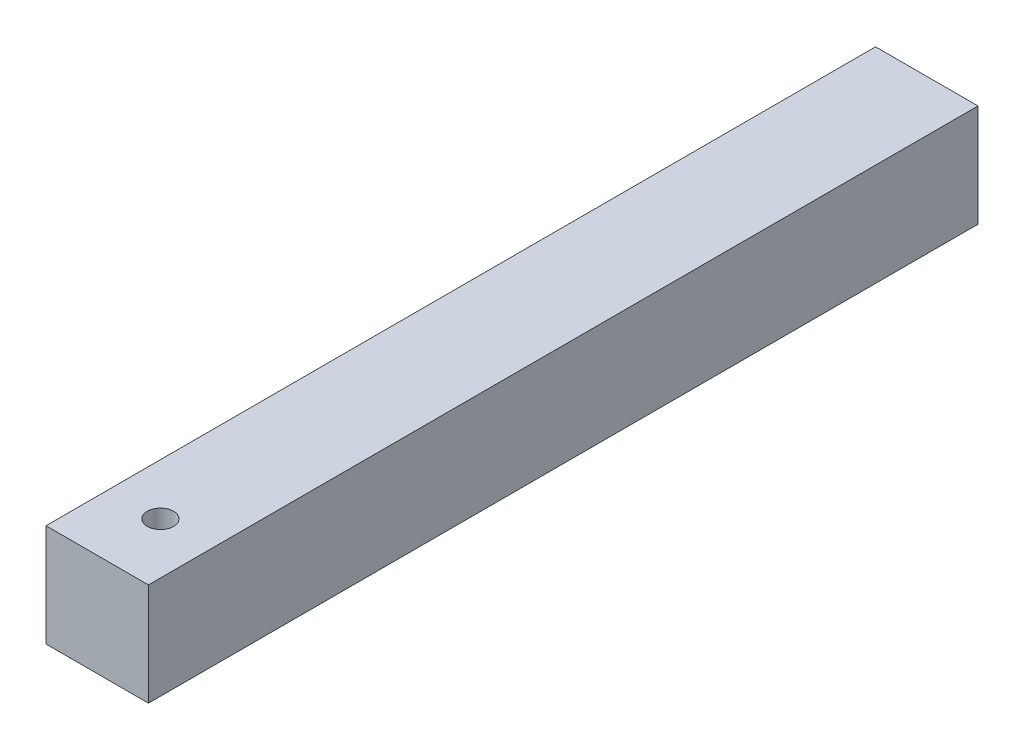
ISO-10303-21;
HEADER;
FILE_DESCRIPTION(('STEP AP214'),'2;1');
FILE_NAME('part.step','',(''),(''),'','','');
FILE_SCHEMA(('AUTOMOTIVE_DESIGN { 1 0 10303 214 1 1 1 1 }'));
ENDSEC;
DATA;
#1=APPLICATION_CONTEXT('core data for automotive mechanical design processes');
#2=APPLICATION_PROTOCOL_DEFINITION('international standard','automotive_design',2000,#1);
#3=PRODUCT_CONTEXT('',#1,'mechanical');
#4=PRODUCT('Part','Part','',(#3));
#5=PRODUCT_RELATED_PRODUCT_CATEGORY('part','',(#4));
#6=PRODUCT_DEFINITION_FORMATION('','',#4);
#7=PRODUCT_DEFINITION_CONTEXT('part definition',#1,'design');
#8=PRODUCT_DEFINITION('design','',#6,#7);
#9=PRODUCT_DEFINITION_SHAPE('','',#8);
#10=(LENGTH_UNIT() NAMED_UNIT(*) SI_UNIT(.MILLI.,.METRE.));
#11=(NAMED_UNIT(*) PLANE_ANGLE_UNIT() SI_UNIT($,.RADIAN.));
#12=(NAMED_UNIT(*) SI_UNIT($,.STERADIAN.) SOLID_ANGLE_UNIT());
#13=UNCERTAINTY_MEASURE_WITH_UNIT(LENGTH_MEASURE(1.E-05),#10,'distance_accuracy_value','');
#14=(GEOMETRIC_REPRESENTATION_CONTEXT(3) GLOBAL_UNCERTAINTY_ASSIGNED_CONTEXT((#13)) GLOBAL_UNIT_ASSIGNED_CONTEXT((#10,
#11,#12)) REPRESENTATION_CONTEXT('',''));
#15=CARTESIAN_POINT('',(0.,0.,0.));
#16=DIRECTION('',(0.,0.,1.));
#17=DIRECTION('',(1.,0.,0.));
#18=AXIS2_PLACEMENT_3D('',#15,#16,#17);
#19=CARTESIAN_POINT('',(-6.35,-6.35,200.));
#20=DIRECTION('',(0.,1.,0.));
#21=DIRECTION('',(0.,0.,1.));
#22=AXIS2_PLACEMENT_3D('',#19,#20,#21);
#23=PLANE('',#22);
#24=CARTESIAN_POINT('',(6.,-6.35,184.76));
#25=DIRECTION('',(0.,1.,0.));
#26=DIRECTION('',(0.,0.,1.));
#27=AXIS2_PLACEMENT_3D('',#24,#25,#26);
#28=CIRCLE('',#27,3.175);
#29=CARTESIAN_POINT('',(6.,-6.35,187.935));
#30=VERTEX_POINT('',#29);
#31=EDGE_CURVE('E217',#30,#30,#28,.T.);
#32=ORIENTED_EDGE('',*,*,#31,.T.);
#33=EDGE_LOOP('',(#32));
#34=FACE_BOUND('',#33,.T.);
#35=DIRECTION('',(1.,0.,0.));
#36=VECTOR('',#35,1.);
#37=CARTESIAN_POINT('',(-6.35,-6.35,0.));
#38=LINE('',#37,#36);
#39=CARTESIAN_POINT('',(-6.35,-6.35,0.));
#40=VERTEX_POINT('',#39);
#41=CARTESIAN_POINT('',(18.35,-6.35,0.));
#42=VERTEX_POINT('',#41);
#43=EDGE_CURVE('E176',#40,#42,#38,.T.);
#44=ORIENTED_EDGE('',*,*,#43,.T.);
#45=DIRECTION('',(0.,0.,-1.));
#46=VECTOR('',#45,1.);
#47=CARTESIAN_POINT('',(18.35,-6.35,200.));
#48=LINE('',#47,#46);
#49=CARTESIAN_POINT('',(18.35,-6.35,200.));
#50=VERTEX_POINT('',#49);
#51=EDGE_CURVE('E12',#50,#42,#48,.T.);
#52=ORIENTED_EDGE('',*,*,#51,.F.);
#53=DIRECTION('',(1.,0.,0.));
#54=VECTOR('',#53,1.);
#55=CARTESIAN_POINT('',(-6.35,-6.35,200.));
#56=LINE('',#55,#54);
#57=CARTESIAN_POINT('',(-6.35,-6.35,200.));
#58=VERTEX_POINT('',#57);
#59=EDGE_CURVE('E163',#58,#50,#56,.T.);
#60=ORIENTED_EDGE('',*,*,#59,.F.);
#61=DIRECTION('',(0.,0.,-1.));
#62=VECTOR('',#61,1.);
#63=CARTESIAN_POINT('',(-6.35,-6.35,200.));
#64=LINE('',#63,#62);
#65=EDGE_CURVE('E66',#58,#40,#64,.T.);
#66=ORIENTED_EDGE('',*,*,#65,.T.);
#67=EDGE_LOOP('',(#44,#52,#60,#66));
#68=FACE_BOUND('',#67,.T.);
#69=ADVANCED_FACE('F41',(#34,#68),#23,.F.);
#70=CARTESIAN_POINT('',(18.35,-6.35,200.));
#71=DIRECTION('',(-1.,0.,0.));
#72=DIRECTION('',(0.,0.,1.));
#73=AXIS2_PLACEMENT_3D('',#70,#71,#72);
#74=PLANE('',#73);
#75=DIRECTION('',(0.,1.,0.));
#76=VECTOR('',#75,1.);
#77=CARTESIAN_POINT('',(18.35,-6.35,0.));
#78=LINE('',#77,#76);
#79=CARTESIAN_POINT('',(18.35,18.35,0.));
#80=VERTEX_POINT('',#79);
#81=EDGE_CURVE('E179',#42,#80,#78,.T.);
#82=ORIENTED_EDGE('',*,*,#81,.T.);
#83=DIRECTION('',(0.,0.,-1.));
#84=VECTOR('',#83,1.);
#85=CARTESIAN_POINT('',(18.35,18.35,200.));
#86=LINE('',#85,#84);
#87=CARTESIAN_POINT('',(18.35,18.35,200.));
#88=VERTEX_POINT('',#87);
#89=EDGE_CURVE('E50',#88,#80,#86,.T.);
#90=ORIENTED_EDGE('',*,*,#89,.F.);
#91=DIRECTION('',(0.,1.,0.));
#92=VECTOR('',#91,1.);
#93=CARTESIAN_POINT('',(18.35,-6.35,200.));
#94=LINE('',#93,#92);
#95=EDGE_CURVE('E92',#50,#88,#94,.T.);
#96=ORIENTED_EDGE('',*,*,#95,.F.);
#97=ORIENTED_EDGE('',*,*,#51,.T.);
#98=EDGE_LOOP('',(#82,#90,#96,#97));
#99=FACE_BOUND('',#98,.T.);
#100=ADVANCED_FACE('F200',(#99),#74,.F.);
#101=CARTESIAN_POINT('',(-6.35,18.35,200.));
#102=DIRECTION('',(0.,1.,0.));
#103=DIRECTION('',(0.,0.,1.));
#104=AXIS2_PLACEMENT_3D('',#101,#102,#103);
#105=PLANE('',#104);
#106=CARTESIAN_POINT('',(6.,18.35,184.76));
#107=DIRECTION('',(0.,1.,0.));
#108=DIRECTION('',(0.,0.,1.));
#109=AXIS2_PLACEMENT_3D('',#106,#107,#108);
#110=CIRCLE('',#109,3.175);
#111=CARTESIAN_POINT('',(6.,18.35,187.935));
#112=VERTEX_POINT('',#111);
#113=EDGE_CURVE('E220',#112,#112,#110,.T.);
#114=ORIENTED_EDGE('',*,*,#113,.F.);
#115=EDGE_LOOP('',(#114));
#116=FACE_BOUND('',#115,.T.);
#117=DIRECTION('',(1.,0.,0.));
#118=VECTOR('',#117,1.);
#119=CARTESIAN_POINT('',(-6.35,18.35,0.));
#120=LINE('',#119,#118);
#121=CARTESIAN_POINT('',(-6.35,18.35,0.));
#122=VERTEX_POINT('',#121);
#123=EDGE_CURVE('E183',#122,#80,#120,.T.);
#124=ORIENTED_EDGE('',*,*,#123,.F.);
#125=DIRECTION('',(0.,0.,-1.));
#126=VECTOR('',#125,1.);
#127=CARTESIAN_POINT('',(-6.35,18.35,200.));
#128=LINE('',#127,#126);
#129=CARTESIAN_POINT('',(-6.35,18.35,200.));
#130=VERTEX_POINT('',#129);
#131=EDGE_CURVE('E192',#130,#122,#128,.T.);
#132=ORIENTED_EDGE('',*,*,#131,.F.);
#133=DIRECTION('',(1.,0.,0.));
#134=VECTOR('',#133,1.);
#135=CARTESIAN_POINT('',(-6.35,18.35,200.));
#136=LINE('',#135,#134);
#137=EDGE_CURVE('E169',#130,#88,#136,.T.);
#138=ORIENTED_EDGE('',*,*,#137,.T.);
#139=ORIENTED_EDGE('',*,*,#89,.T.);
#140=EDGE_LOOP('',(#124,#132,#138,#139));
#141=FACE_BOUND('',#140,.T.);
#142=ADVANCED_FACE('F198',(#116,#141),#105,.T.);
#143=CARTESIAN_POINT('',(-6.35,-6.35,200.));
#144=DIRECTION('',(-1.,0.,0.));
#145=DIRECTION('',(0.,0.,1.));
#146=AXIS2_PLACEMENT_3D('',#143,#144,#145);
#147=PLANE('',#146);
#148=DIRECTION('',(0.,1.,0.));
#149=VECTOR('',#148,1.);
#150=CARTESIAN_POINT('',(-6.35,-6.35,0.));
#151=LINE('',#150,#149);
#152=EDGE_CURVE('E166',#40,#122,#151,.T.);
#153=ORIENTED_EDGE('',*,*,#152,.F.);
#154=ORIENTED_EDGE('',*,*,#65,.F.);
#155=DIRECTION('',(0.,1.,0.));
#156=VECTOR('',#155,1.);
#157=CARTESIAN_POINT('',(-6.35,-6.35,200.));
#158=LINE('',#157,#156);
#159=EDGE_CURVE('E173',#58,#130,#158,.T.);
#160=ORIENTED_EDGE('',*,*,#159,.T.);
#161=ORIENTED_EDGE('',*,*,#131,.T.);
#162=EDGE_LOOP('',(#153,#154,#160,#161));
#163=FACE_BOUND('',#162,.T.);
#164=ADVANCED_FACE('F204',(#163),#147,.T.);
#165=CARTESIAN_POINT('',(0.,0.,200.));
#166=DIRECTION('',(0.,0.,1.));
#167=DIRECTION('',(1.,0.,0.));
#168=AXIS2_PLACEMENT_3D('',#165,#166,#167);
#169=PLANE('',#168);
#170=ORIENTED_EDGE('',*,*,#59,.T.);
#171=ORIENTED_EDGE('',*,*,#95,.T.);
#172=ORIENTED_EDGE('',*,*,#137,.F.);
#173=ORIENTED_EDGE('',*,*,#159,.F.);
#174=EDGE_LOOP('',(#170,#171,#172,#173));
#175=FACE_BOUND('',#174,.T.);
#176=ADVANCED_FACE('F207',(#175),#169,.T.);
#177=CARTESIAN_POINT('',(0.,0.,0.));
#178=DIRECTION('',(0.,0.,1.));
#179=DIRECTION('',(1.,0.,0.));
#180=AXIS2_PLACEMENT_3D('',#177,#178,#179);
#181=PLANE('',#180);
#182=DIRECTION('',(1.,0.,0.));
#183=VECTOR('',#182,1.);
#184=CARTESIAN_POINT('',(0.,12.,0.));
#185=LINE('',#184,#183);
#186=CARTESIAN_POINT('',(0.,12.,0.));
#187=VERTEX_POINT('',#186);
#188=CARTESIAN_POINT('',(12.,12.,0.));
#189=VERTEX_POINT('',#188);
#190=EDGE_CURVE('E141',#187,#189,#185,.T.);
#191=ORIENTED_EDGE('',*,*,#190,.F.);
#192=DIRECTION('',(0.,1.,0.));
#193=VECTOR('',#192,1.);
#194=CARTESIAN_POINT('',(0.,0.,0.));
#195=LINE('',#194,#193);
#196=CARTESIAN_POINT('',(0.,0.,0.));
#197=VERTEX_POINT('',#196);
#198=EDGE_CURVE('E133',#197,#187,#195,.T.);
#199=ORIENTED_EDGE('',*,*,#198,.F.);
#200=DIRECTION('',(1.,0.,0.));
#201=VECTOR('',#200,1.);
#202=CARTESIAN_POINT('',(0.,0.,0.));
#203=LINE('',#202,#201);
#204=CARTESIAN_POINT('',(12.,0.,0.));
#205=VERTEX_POINT('',#204);
#206=EDGE_CURVE('E147',#197,#205,#203,.T.);
#207=ORIENTED_EDGE('',*,*,#206,.T.);
#208=DIRECTION('',(0.,1.,0.));
#209=VECTOR('',#208,1.);
#210=CARTESIAN_POINT('',(12.,0.,0.));
#211=LINE('',#210,#209);
#212=EDGE_CURVE('E57',#205,#189,#211,.T.);
#213=ORIENTED_EDGE('',*,*,#212,.T.);
#214=EDGE_LOOP('',(#191,#199,#207,#213));
#215=FACE_BOUND('',#214,.T.);
#216=ORIENTED_EDGE('',*,*,#43,.F.);
#217=ORIENTED_EDGE('',*,*,#152,.T.);
#218=ORIENTED_EDGE('',*,*,#123,.T.);
#219=ORIENTED_EDGE('',*,*,#81,.F.);
#220=EDGE_LOOP('',(#216,#217,#218,#219));
#221=FACE_BOUND('',#220,.T.);
#222=ADVANCED_FACE('F203',(#215,#221),#181,.F.);
#223=CARTESIAN_POINT('',(0.,0.,193.65));
#224=DIRECTION('',(0.,0.,1.));
#225=DIRECTION('',(1.,0.,0.));
#226=AXIS2_PLACEMENT_3D('',#223,#224,#225);
#227=PLANE('',#226);
#228=DIRECTION('',(0.,1.,0.));
#229=VECTOR('',#228,1.);
#230=CARTESIAN_POINT('',(0.,0.,193.65));
#231=LINE('',#230,#229);
#232=CARTESIAN_POINT('',(0.,0.,193.65));
#233=VERTEX_POINT('',#232);
#234=CARTESIAN_POINT('',(0.,12.,193.65));
#235=VERTEX_POINT('',#234);
#236=EDGE_CURVE('E130',#233,#235,#231,.T.);
#237=ORIENTED_EDGE('',*,*,#236,.T.);
#238=DIRECTION('',(1.,0.,0.));
#239=VECTOR('',#238,1.);
#240=CARTESIAN_POINT('',(0.,12.,193.65));
#241=LINE('',#240,#239);
#242=CARTESIAN_POINT('',(12.,12.,193.65));
#243=VERTEX_POINT('',#242);
#244=EDGE_CURVE('E116',#235,#243,#241,.T.);
#245=ORIENTED_EDGE('',*,*,#244,.T.);
#246=DIRECTION('',(0.,1.,0.));
#247=VECTOR('',#246,1.);
#248=CARTESIAN_POINT('',(12.,0.,193.65));
#249=LINE('',#248,#247);
#250=CARTESIAN_POINT('',(12.,0.,193.65));
#251=VERTEX_POINT('',#250);
#252=EDGE_CURVE('E151',#251,#243,#249,.T.);
#253=ORIENTED_EDGE('',*,*,#252,.F.);
#254=DIRECTION('',(1.,0.,0.));
#255=VECTOR('',#254,1.);
#256=CARTESIAN_POINT('',(0.,0.,193.65));
#257=LINE('',#256,#255);
#258=EDGE_CURVE('E138',#233,#251,#257,.T.);
#259=ORIENTED_EDGE('',*,*,#258,.F.);
#260=EDGE_LOOP('',(#237,#245,#253,#259));
#261=FACE_BOUND('',#260,.T.);
#262=ADVANCED_FACE('F137',(#261),#227,.F.);
#263=CARTESIAN_POINT('',(0.,0.,216.970562748477));
#264=DIRECTION('',(-1.,0.,0.));
#265=DIRECTION('',(0.,0.,1.));
#266=AXIS2_PLACEMENT_3D('',#263,#264,#265);
#267=PLANE('',#266);
#268=DIRECTION('',(0.,0.,-1.));
#269=VECTOR('',#268,1.);
#270=CARTESIAN_POINT('',(0.,0.,216.970562748477));
#271=LINE('',#270,#269);
#272=EDGE_CURVE('E160',#233,#197,#271,.T.);
#273=ORIENTED_EDGE('',*,*,#272,.T.);
#274=ORIENTED_EDGE('',*,*,#198,.T.);
#275=DIRECTION('',(0.,0.,-1.));
#276=VECTOR('',#275,1.);
#277=CARTESIAN_POINT('',(0.,12.,216.970562748477));
#278=LINE('',#277,#276);
#279=EDGE_CURVE('E120',#235,#187,#278,.T.);
#280=ORIENTED_EDGE('',*,*,#279,.F.);
#281=ORIENTED_EDGE('',*,*,#236,.F.);
#282=EDGE_LOOP('',(#273,#274,#280,#281));
#283=FACE_BOUND('',#282,.T.);
#284=ADVANCED_FACE('F129',(#283),#267,.F.);
#285=CARTESIAN_POINT('',(0.,12.,216.970562748477));
#286=DIRECTION('',(0.,1.,0.));
#287=DIRECTION('',(0.,0.,1.));
#288=AXIS2_PLACEMENT_3D('',#285,#286,#287);
#289=PLANE('',#288);
#290=CARTESIAN_POINT('',(6.,12.,184.76));
#291=DIRECTION('',(0.,1.,0.));
#292=DIRECTION('',(0.,0.,1.));
#293=AXIS2_PLACEMENT_3D('',#290,#291,#292);
#294=CIRCLE('',#293,3.175);
#295=CARTESIAN_POINT('',(6.,12.,187.935));
#296=VERTEX_POINT('',#295);
#297=EDGE_CURVE('E152',#296,#296,#294,.T.);
#298=ORIENTED_EDGE('',*,*,#297,.T.);
#299=EDGE_LOOP('',(#298));
#300=FACE_BOUND('',#299,.T.);
#301=ORIENTED_EDGE('',*,*,#279,.T.);
#302=ORIENTED_EDGE('',*,*,#190,.T.);
#303=DIRECTION('',(0.,0.,-1.));
#304=VECTOR('',#303,1.);
#305=CARTESIAN_POINT('',(12.,12.,216.970562748477));
#306=LINE('',#305,#304);
#307=EDGE_CURVE('E122',#243,#189,#306,.T.);
#308=ORIENTED_EDGE('',*,*,#307,.F.);
#309=ORIENTED_EDGE('',*,*,#244,.F.);
#310=EDGE_LOOP('',(#301,#302,#308,#309));
#311=FACE_BOUND('',#310,.T.);
#312=ADVANCED_FACE('F118',(#300,#311),#289,.F.);
#313=CARTESIAN_POINT('',(12.,0.,216.970562748477));
#314=DIRECTION('',(-1.,0.,0.));
#315=DIRECTION('',(0.,0.,1.));
#316=AXIS2_PLACEMENT_3D('',#313,#314,#315);
#317=PLANE('',#316);
#318=ORIENTED_EDGE('',*,*,#252,.T.);
#319=ORIENTED_EDGE('',*,*,#307,.T.);
#320=ORIENTED_EDGE('',*,*,#212,.F.);
#321=DIRECTION('',(0.,0.,-1.));
#322=VECTOR('',#321,1.);
#323=CARTESIAN_POINT('',(12.,0.,216.970562748477));
#324=LINE('',#323,#322);
#325=EDGE_CURVE('E155',#251,#205,#324,.T.);
#326=ORIENTED_EDGE('',*,*,#325,.F.);
#327=EDGE_LOOP('',(#318,#319,#320,#326));
#328=FACE_BOUND('',#327,.T.);
#329=ADVANCED_FACE('F239',(#328),#317,.T.);
#330=CARTESIAN_POINT('',(0.,0.,216.970562748477));
#331=DIRECTION('',(0.,1.,0.));
#332=DIRECTION('',(0.,0.,1.));
#333=AXIS2_PLACEMENT_3D('',#330,#331,#332);
#334=PLANE('',#333);
#335=CARTESIAN_POINT('',(6.,0.,184.76));
#336=DIRECTION('',(0.,1.,0.));
#337=DIRECTION('',(0.,0.,1.));
#338=AXIS2_PLACEMENT_3D('',#335,#336,#337);
#339=CIRCLE('',#338,3.175);
#340=CARTESIAN_POINT('',(6.,0.,187.935));
#341=VERTEX_POINT('',#340);
#342=EDGE_CURVE('E44',#341,#341,#339,.T.);
#343=ORIENTED_EDGE('',*,*,#342,.F.);
#344=EDGE_LOOP('',(#343));
#345=FACE_BOUND('',#344,.T.);
#346=ORIENTED_EDGE('',*,*,#258,.T.);
#347=ORIENTED_EDGE('',*,*,#325,.T.);
#348=ORIENTED_EDGE('',*,*,#206,.F.);
#349=ORIENTED_EDGE('',*,*,#272,.F.);
#350=EDGE_LOOP('',(#346,#347,#348,#349));
#351=FACE_BOUND('',#350,.T.);
#352=ADVANCED_FACE('F238',(#345,#351),#334,.T.);
#353=CARTESIAN_POINT('',(6.,-6.35,184.76));
#354=DIRECTION('',(0.,1.,0.));
#355=DIRECTION('',(0.,0.,1.));
#356=AXIS2_PLACEMENT_3D('',#353,#354,#355);
#357=CYLINDRICAL_SURFACE('',#356,3.175);
#358=ORIENTED_EDGE('',*,*,#342,.T.);
#359=EDGE_LOOP('',(#358));
#360=FACE_BOUND('',#359,.T.);
#361=ORIENTED_EDGE('',*,*,#31,.F.);
#362=EDGE_LOOP('',(#361));
#363=FACE_BOUND('',#362,.T.);
#364=ADVANCED_FACE('F246',(#360,#363),#357,.F.);
#365=ORIENTED_EDGE('',*,*,#113,.T.);
#366=EDGE_LOOP('',(#365));
#367=FACE_BOUND('',#366,.T.);
#368=ORIENTED_EDGE('',*,*,#297,.F.);
#369=EDGE_LOOP('',(#368));
#370=FACE_BOUND('',#369,.T.);
#371=ADVANCED_FACE('F269',(#367,#370),#357,.F.);
#372=CLOSED_SHELL('',(#69,#100,#142,#164,#176,#222,#262,#284,#312,#329,#352,#364,#371));
#373=MANIFOLD_SOLID_BREP('B2',#372);
#374=ADVANCED_BREP_SHAPE_REPRESENTATION('',(#18,#373),#14);
#375=SHAPE_DEFINITION_REPRESENTATION(#9,#374);
ENDSEC;
END-ISO-10303-21;
